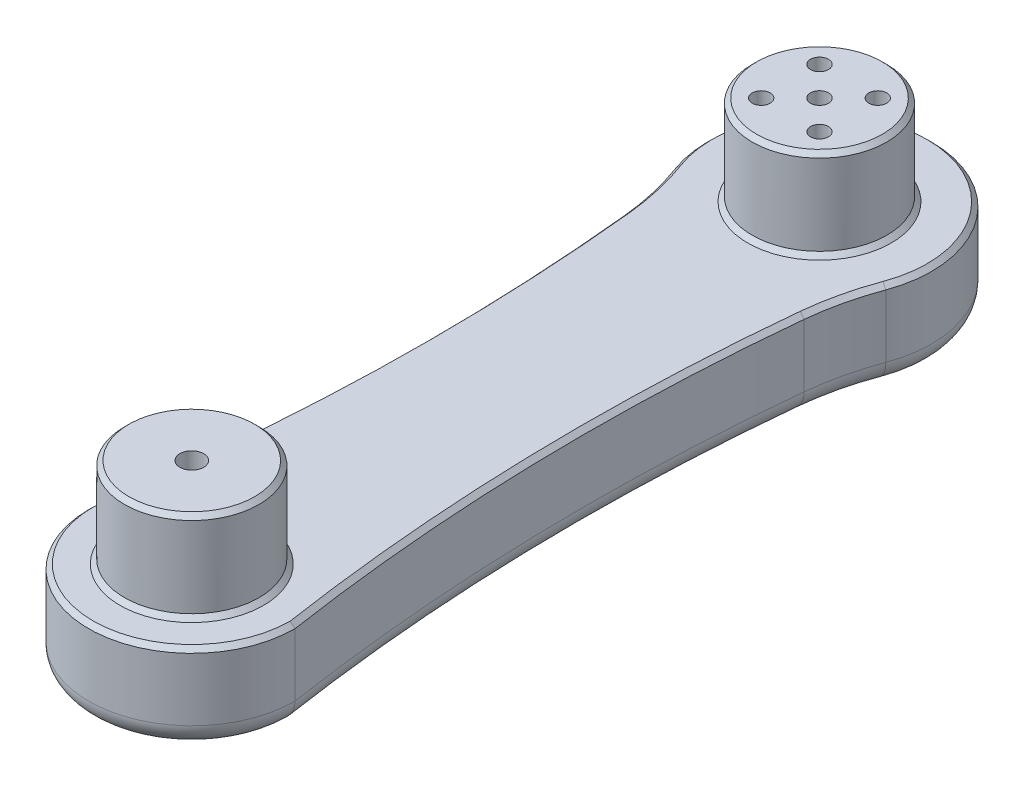
ISO-10303-21;
HEADER;
FILE_DESCRIPTION(('STEP AP214'),'2;1');
FILE_NAME('part.step','',(''),(''),'','','');
FILE_SCHEMA(('AUTOMOTIVE_DESIGN { 1 0 10303 214 1 1 1 1 }'));
ENDSEC;
DATA;
#1=APPLICATION_CONTEXT('core data for automotive mechanical design processes');
#2=APPLICATION_PROTOCOL_DEFINITION('international standard','automotive_design',2000,#1);
#3=PRODUCT_CONTEXT('',#1,'mechanical');
#4=PRODUCT('Part','Part','',(#3));
#5=PRODUCT_RELATED_PRODUCT_CATEGORY('part','',(#4));
#6=PRODUCT_DEFINITION_FORMATION('','',#4);
#7=PRODUCT_DEFINITION_CONTEXT('part definition',#1,'design');
#8=PRODUCT_DEFINITION('design','',#6,#7);
#9=PRODUCT_DEFINITION_SHAPE('','',#8);
#10=(LENGTH_UNIT() NAMED_UNIT(*) SI_UNIT(.MILLI.,.METRE.));
#11=(NAMED_UNIT(*) PLANE_ANGLE_UNIT() SI_UNIT($,.RADIAN.));
#12=(NAMED_UNIT(*) SI_UNIT($,.STERADIAN.) SOLID_ANGLE_UNIT());
#13=UNCERTAINTY_MEASURE_WITH_UNIT(LENGTH_MEASURE(1.E-05),#10,'distance_accuracy_value','');
#14=(GEOMETRIC_REPRESENTATION_CONTEXT(3) GLOBAL_UNCERTAINTY_ASSIGNED_CONTEXT((#13)) GLOBAL_UNIT_ASSIGNED_CONTEXT((#10,
#11,#12)) REPRESENTATION_CONTEXT('',''));
#15=CARTESIAN_POINT('',(0.,0.,0.));
#16=DIRECTION('',(0.,0.,1.));
#17=DIRECTION('',(1.,0.,0.));
#18=AXIS2_PLACEMENT_3D('',#15,#16,#17);
#19=CARTESIAN_POINT('',(0.,0.,0.));
#20=DIRECTION('',(0.,1.,0.));
#21=DIRECTION('',(0.,0.,1.));
#22=AXIS2_PLACEMENT_3D('',#19,#20,#21);
#23=CYLINDRICAL_SURFACE('',#22,2.65);
#24=CARTESIAN_POINT('',(0.,40.,0.));
#25=DIRECTION('',(0.,1.,0.));
#26=DIRECTION('',(0.,0.,1.));
#27=AXIS2_PLACEMENT_3D('',#24,#25,#26);
#28=CIRCLE('',#27,2.65);
#29=CARTESIAN_POINT('',(0.,40.,2.65));
#30=VERTEX_POINT('',#29);
#31=EDGE_CURVE('E145',#30,#30,#28,.T.);
#32=ORIENTED_EDGE('',*,*,#31,.T.);
#33=EDGE_LOOP('',(#32));
#34=FACE_BOUND('',#33,.T.);
#35=CARTESIAN_POINT('',(0.,8.,0.));
#36=DIRECTION('',(0.,-1.,0.));
#37=DIRECTION('',(0.,0.,-1.));
#38=AXIS2_PLACEMENT_3D('',#35,#36,#37);
#39=CIRCLE('',#38,2.65);
#40=CARTESIAN_POINT('',(0.,8.,-2.65));
#41=VERTEX_POINT('',#40);
#42=EDGE_CURVE('E265',#41,#41,#39,.F.);
#43=ORIENTED_EDGE('',*,*,#42,.F.);
#44=EDGE_LOOP('',(#43));
#45=FACE_BOUND('',#44,.T.);
#46=ADVANCED_FACE('F41',(#34,#45),#23,.F.);
#47=CARTESIAN_POINT('',(79.7317394305135,20.,-110.540710677535));
#48=DIRECTION('',(0.,-1.,0.));
#49=DIRECTION('',(0.,0.,-1.));
#50=AXIS2_PLACEMENT_3D('',#47,#48,#49);
#51=CYLINDRICAL_SURFACE('',#50,60.);
#52=DIRECTION('',(0.,-1.,0.));
#53=VECTOR('',#52,1.);
#54=CARTESIAN_POINT('',(20.0338907014118,20.,-116.554599362678));
#55=LINE('',#54,#53);
#56=CARTESIAN_POINT('',(20.0338907014118,19.,-116.554599362678));
#57=VERTEX_POINT('',#56);
#58=CARTESIAN_POINT('',(20.0338907014118,5.,-116.554599362678));
#59=VERTEX_POINT('',#58);
#60=EDGE_CURVE('E231',#57,#59,#55,.T.);
#61=ORIENTED_EDGE('',*,*,#60,.T.);
#62=CARTESIAN_POINT('',(79.7317394305135,5.,-110.540710677535));
#63=DIRECTION('',(0.,-1.,0.));
#64=DIRECTION('',(0.,0.,-1.));
#65=AXIS2_PLACEMENT_3D('',#62,#63,#64);
#66=CIRCLE('',#65,60.);
#67=CARTESIAN_POINT('',(23.4505115972098,5.,-131.335503140452));
#68=VERTEX_POINT('',#67);
#69=EDGE_CURVE('E251',#59,#68,#66,.T.);
#70=ORIENTED_EDGE('',*,*,#69,.T.);
#71=DIRECTION('',(0.,-1.,0.));
#72=VECTOR('',#71,1.);
#73=CARTESIAN_POINT('',(23.4505115972098,20.,-131.335503140452));
#74=LINE('',#73,#72);
#75=CARTESIAN_POINT('',(23.4505115972098,19.,-131.335503140452));
#76=VERTEX_POINT('',#75);
#77=EDGE_CURVE('E411',#76,#68,#74,.T.);
#78=ORIENTED_EDGE('',*,*,#77,.F.);
#79=CARTESIAN_POINT('',(79.7317394305135,19.,-110.540710677535));
#80=DIRECTION('',(0.,-1.,0.));
#81=DIRECTION('',(0.,0.,-1.));
#82=AXIS2_PLACEMENT_3D('',#79,#80,#81);
#83=CIRCLE('',#82,60.);
#84=EDGE_CURVE('E176',#76,#57,#83,.F.);
#85=ORIENTED_EDGE('',*,*,#84,.T.);
#86=EDGE_LOOP('',(#61,#70,#78,#85));
#87=FACE_BOUND('',#86,.T.);
#88=ADVANCED_FACE('F346',(#87),#51,.F.);
#89=CARTESIAN_POINT('',(0.,20.,-140.));
#90=DIRECTION('',(0.,-1.,0.));
#91=DIRECTION('',(0.,0.,-1.));
#92=AXIS2_PLACEMENT_3D('',#89,#90,#91);
#93=CYLINDRICAL_SURFACE('',#92,25.);
#94=ORIENTED_EDGE('',*,*,#77,.T.);
#95=CARTESIAN_POINT('',(0.,5.,-140.));
#96=DIRECTION('',(0.,-1.,0.));
#97=DIRECTION('',(0.,0.,-1.));
#98=AXIS2_PLACEMENT_3D('',#95,#96,#97);
#99=CIRCLE('',#98,25.);
#100=CARTESIAN_POINT('',(-23.4505115972098,5.,-131.335503140451));
#101=VERTEX_POINT('',#100);
#102=EDGE_CURVE('E249',#68,#101,#99,.F.);
#103=ORIENTED_EDGE('',*,*,#102,.T.);
#104=DIRECTION('',(0.,-1.,0.));
#105=VECTOR('',#104,1.);
#106=CARTESIAN_POINT('',(-23.4505115972098,20.,-131.335503140451));
#107=LINE('',#106,#105);
#108=CARTESIAN_POINT('',(-23.4505115972098,19.,-131.335503140451));
#109=VERTEX_POINT('',#108);
#110=EDGE_CURVE('E415',#109,#101,#107,.T.);
#111=ORIENTED_EDGE('',*,*,#110,.F.);
#112=CARTESIAN_POINT('',(0.,19.,-140.));
#113=DIRECTION('',(0.,-1.,0.));
#114=DIRECTION('',(0.,0.,-1.));
#115=AXIS2_PLACEMENT_3D('',#112,#113,#114);
#116=CIRCLE('',#115,25.);
#117=EDGE_CURVE('E174',#109,#76,#116,.T.);
#118=ORIENTED_EDGE('',*,*,#117,.T.);
#119=EDGE_LOOP('',(#94,#103,#111,#118));
#120=FACE_BOUND('',#119,.T.);
#121=ADVANCED_FACE('F353',(#120),#93,.T.);
#122=CARTESIAN_POINT('',(-79.7317394305134,20.,-110.540710677535));
#123=DIRECTION('',(0.,-1.,0.));
#124=DIRECTION('',(0.,0.,-1.));
#125=AXIS2_PLACEMENT_3D('',#122,#123,#124);
#126=CYLINDRICAL_SURFACE('',#125,60.);
#127=ORIENTED_EDGE('',*,*,#110,.T.);
#128=CARTESIAN_POINT('',(-79.7317394305134,5.,-110.540710677535));
#129=DIRECTION('',(0.,-1.,0.));
#130=DIRECTION('',(0.,0.,-1.));
#131=AXIS2_PLACEMENT_3D('',#128,#129,#130);
#132=CIRCLE('',#131,60.);
#133=CARTESIAN_POINT('',(-20.0338907014117,5.,-116.554599362678));
#134=VERTEX_POINT('',#133);
#135=EDGE_CURVE('E247',#101,#134,#132,.T.);
#136=ORIENTED_EDGE('',*,*,#135,.T.);
#137=DIRECTION('',(0.,-1.,0.));
#138=VECTOR('',#137,1.);
#139=CARTESIAN_POINT('',(-20.0338907014117,20.,-116.554599362678));
#140=LINE('',#139,#138);
#141=CARTESIAN_POINT('',(-20.0338907014117,19.,-116.554599362678));
#142=VERTEX_POINT('',#141);
#143=EDGE_CURVE('E434',#142,#134,#140,.T.);
#144=ORIENTED_EDGE('',*,*,#143,.F.);
#145=CARTESIAN_POINT('',(-79.7317394305134,19.,-110.540710677535));
#146=DIRECTION('',(0.,-1.,0.));
#147=DIRECTION('',(0.,0.,-1.));
#148=AXIS2_PLACEMENT_3D('',#145,#146,#147);
#149=CIRCLE('',#148,60.);
#150=EDGE_CURVE('E172',#142,#109,#149,.F.);
#151=ORIENTED_EDGE('',*,*,#150,.T.);
#152=EDGE_LOOP('',(#127,#136,#144,#151));
#153=FACE_BOUND('',#152,.T.);
#154=ADVANCED_FACE('F386',(#153),#126,.F.);
#155=CARTESIAN_POINT('',(-482.165728502631,20.,-70.));
#156=DIRECTION('',(0.,-1.,0.));
#157=DIRECTION('',(0.,0.,-1.));
#158=AXIS2_PLACEMENT_3D('',#155,#156,#157);
#159=CYLINDRICAL_SURFACE('',#158,464.470845405125);
#160=ORIENTED_EDGE('',*,*,#143,.T.);
#161=CARTESIAN_POINT('',(-482.165728502631,5.,-70.));
#162=DIRECTION('',(0.,-1.,0.));
#163=DIRECTION('',(0.,0.,-1.));
#164=AXIS2_PLACEMENT_3D('',#161,#162,#163);
#165=CIRCLE('',#164,464.470845405125);
#166=CARTESIAN_POINT('',(-23.,5.,0.));
#167=VERTEX_POINT('',#166);
#168=EDGE_CURVE('E180',#134,#167,#165,.T.);
#169=ORIENTED_EDGE('',*,*,#168,.T.);
#170=DIRECTION('',(0.,-1.,0.));
#171=VECTOR('',#170,1.);
#172=CARTESIAN_POINT('',(-23.,20.,0.));
#173=LINE('',#172,#171);
#174=CARTESIAN_POINT('',(-23.,19.,0.));
#175=VERTEX_POINT('',#174);
#176=EDGE_CURVE('E432',#175,#167,#173,.T.);
#177=ORIENTED_EDGE('',*,*,#176,.F.);
#178=CARTESIAN_POINT('',(-482.165728502631,19.,-70.));
#179=DIRECTION('',(0.,-1.,0.));
#180=DIRECTION('',(0.,0.,-1.));
#181=AXIS2_PLACEMENT_3D('',#178,#179,#180);
#182=CIRCLE('',#181,464.470845405125);
#183=EDGE_CURVE('E170',#175,#142,#182,.F.);
#184=ORIENTED_EDGE('',*,*,#183,.T.);
#185=EDGE_LOOP('',(#160,#169,#177,#184));
#186=FACE_BOUND('',#185,.T.);
#187=ADVANCED_FACE('F383',(#186),#159,.F.);
#188=CARTESIAN_POINT('',(0.,20.,0.));
#189=DIRECTION('',(0.,-1.,0.));
#190=DIRECTION('',(0.,0.,-1.));
#191=AXIS2_PLACEMENT_3D('',#188,#189,#190);
#192=CYLINDRICAL_SURFACE('',#191,23.);
#193=ORIENTED_EDGE('',*,*,#176,.T.);
#194=CARTESIAN_POINT('',(0.,5.,0.));
#195=DIRECTION('',(0.,-1.,0.));
#196=DIRECTION('',(0.,0.,-1.));
#197=AXIS2_PLACEMENT_3D('',#194,#195,#196);
#198=CIRCLE('',#197,23.);
#199=CARTESIAN_POINT('',(22.9999999999999,5.,-1.2490009027033E-13));
#200=VERTEX_POINT('',#199);
#201=EDGE_CURVE('E57',#167,#200,#198,.F.);
#202=ORIENTED_EDGE('',*,*,#201,.T.);
#203=DIRECTION('',(0.,-1.,0.));
#204=VECTOR('',#203,1.);
#205=CARTESIAN_POINT('',(22.9999999999999,20.,-1.2490009027033E-13));
#206=LINE('',#205,#204);
#207=CARTESIAN_POINT('',(22.9999999999999,19.,-1.2490009027033E-13));
#208=VERTEX_POINT('',#207);
#209=EDGE_CURVE('E431',#208,#200,#206,.T.);
#210=ORIENTED_EDGE('',*,*,#209,.F.);
#211=CARTESIAN_POINT('',(0.,19.,0.));
#212=DIRECTION('',(0.,-1.,0.));
#213=DIRECTION('',(0.,0.,-1.));
#214=AXIS2_PLACEMENT_3D('',#211,#212,#213);
#215=CIRCLE('',#214,23.);
#216=EDGE_CURVE('E163',#208,#175,#215,.T.);
#217=ORIENTED_EDGE('',*,*,#216,.T.);
#218=EDGE_LOOP('',(#193,#202,#210,#217));
#219=FACE_BOUND('',#218,.T.);
#220=ADVANCED_FACE('F380',(#219),#192,.T.);
#221=CARTESIAN_POINT('',(482.165728502631,20.,-70.));
#222=DIRECTION('',(0.,-1.,0.));
#223=DIRECTION('',(0.,0.,-1.));
#224=AXIS2_PLACEMENT_3D('',#221,#222,#223);
#225=CYLINDRICAL_SURFACE('',#224,464.470845405125);
#226=ORIENTED_EDGE('',*,*,#209,.T.);
#227=CARTESIAN_POINT('',(482.165728502631,5.,-70.));
#228=DIRECTION('',(0.,-1.,0.));
#229=DIRECTION('',(0.,0.,-1.));
#230=AXIS2_PLACEMENT_3D('',#227,#228,#229);
#231=CIRCLE('',#230,464.470845405125);
#232=EDGE_CURVE('E64',#200,#59,#231,.T.);
#233=ORIENTED_EDGE('',*,*,#232,.T.);
#234=ORIENTED_EDGE('',*,*,#60,.F.);
#235=CARTESIAN_POINT('',(482.165728502631,19.,-70.));
#236=DIRECTION('',(0.,-1.,0.));
#237=DIRECTION('',(0.,0.,-1.));
#238=AXIS2_PLACEMENT_3D('',#235,#236,#237);
#239=CIRCLE('',#238,464.470845405125);
#240=EDGE_CURVE('E141',#57,#208,#239,.F.);
#241=ORIENTED_EDGE('',*,*,#240,.T.);
#242=EDGE_LOOP('',(#226,#233,#234,#241));
#243=FACE_BOUND('',#242,.T.);
#244=ADVANCED_FACE('F374',(#243),#225,.F.);
#245=CARTESIAN_POINT('',(39.8658697152567,20.,-125.270355338768));
#246=DIRECTION('',(0.,-1.,0.));
#247=DIRECTION('',(0.,0.,-1.));
#248=AXIS2_PLACEMENT_3D('',#245,#246,#247);
#249=PLANE('',#248);
#250=CARTESIAN_POINT('',(0.,20.,-140.));
#251=DIRECTION('',(0.,-1.,0.));
#252=DIRECTION('',(0.,0.,-1.));
#253=AXIS2_PLACEMENT_3D('',#250,#251,#252);
#254=CIRCLE('',#253,16.01);
#255=CARTESIAN_POINT('',(0.,20.,-156.01));
#256=VERTEX_POINT('',#255);
#257=EDGE_CURVE('E50',#256,#256,#254,.T.);
#258=ORIENTED_EDGE('',*,*,#257,.T.);
#259=EDGE_LOOP('',(#258));
#260=FACE_BOUND('',#259,.T.);
#261=CARTESIAN_POINT('',(0.,20.,0.));
#262=DIRECTION('',(0.,-1.,0.));
#263=DIRECTION('',(0.,0.,-1.));
#264=AXIS2_PLACEMENT_3D('',#261,#262,#263);
#265=CIRCLE('',#264,22.);
#266=CARTESIAN_POINT('',(-21.9998724689642,20.,0.0749089401107759));
#267=VERTEX_POINT('',#266);
#268=CARTESIAN_POINT('',(21.9998724689643,20.,0.0749089401108745));
#269=VERTEX_POINT('',#268);
#270=EDGE_CURVE('E160',#267,#269,#265,.F.);
#271=ORIENTED_EDGE('',*,*,#270,.T.);
#272=CARTESIAN_POINT('',(482.165728502631,20.,-70.));
#273=DIRECTION('',(0.,-1.,0.));
#274=DIRECTION('',(0.,0.,-1.));
#275=AXIS2_PLACEMENT_3D('',#272,#273,#274);
#276=CIRCLE('',#275,465.470845405125);
#277=CARTESIAN_POINT('',(19.0389265559268,20.,-116.654830840764));
#278=VERTEX_POINT('',#277);
#279=EDGE_CURVE('E139',#269,#278,#276,.T.);
#280=ORIENTED_EDGE('',*,*,#279,.T.);
#281=CARTESIAN_POINT('',(79.7317394305135,20.,-110.540710677535));
#282=DIRECTION('',(0.,-1.,0.));
#283=DIRECTION('',(0.,0.,-1.));
#284=AXIS2_PLACEMENT_3D('',#281,#282,#283);
#285=CIRCLE('',#284,61.);
#286=CARTESIAN_POINT('',(22.5124911333215,20.,-131.682083014833));
#287=VERTEX_POINT('',#286);
#288=EDGE_CURVE('E148',#278,#287,#285,.T.);
#289=ORIENTED_EDGE('',*,*,#288,.T.);
#290=CARTESIAN_POINT('',(0.,20.,-140.));
#291=DIRECTION('',(0.,-1.,0.));
#292=DIRECTION('',(0.,0.,-1.));
#293=AXIS2_PLACEMENT_3D('',#290,#291,#292);
#294=CIRCLE('',#293,24.);
#295=CARTESIAN_POINT('',(-22.5124911333214,20.,-131.682083014833));
#296=VERTEX_POINT('',#295);
#297=EDGE_CURVE('E154',#287,#296,#294,.F.);
#298=ORIENTED_EDGE('',*,*,#297,.T.);
#299=CARTESIAN_POINT('',(-79.7317394305134,20.,-110.540710677535));
#300=DIRECTION('',(0.,-1.,0.));
#301=DIRECTION('',(0.,0.,-1.));
#302=AXIS2_PLACEMENT_3D('',#299,#300,#301);
#303=CIRCLE('',#302,61.);
#304=CARTESIAN_POINT('',(-19.0389265559267,20.,-116.654830840764));
#305=VERTEX_POINT('',#304);
#306=EDGE_CURVE('E422',#296,#305,#303,.T.);
#307=ORIENTED_EDGE('',*,*,#306,.T.);
#308=CARTESIAN_POINT('',(-482.165728502631,20.,-70.));
#309=DIRECTION('',(0.,-1.,0.));
#310=DIRECTION('',(0.,0.,-1.));
#311=AXIS2_PLACEMENT_3D('',#308,#309,#310);
#312=CIRCLE('',#311,465.470845405125);
#313=EDGE_CURVE('E165',#305,#267,#312,.T.);
#314=ORIENTED_EDGE('',*,*,#313,.T.);
#315=EDGE_LOOP('',(#271,#280,#289,#298,#307,#314));
#316=FACE_BOUND('',#315,.T.);
#317=CARTESIAN_POINT('',(0.,20.,0.));
#318=DIRECTION('',(0.,-1.,0.));
#319=DIRECTION('',(0.,0.,-1.));
#320=AXIS2_PLACEMENT_3D('',#317,#318,#319);
#321=CIRCLE('',#320,16.01);
#322=CARTESIAN_POINT('',(0.,20.,-16.01));
#323=VERTEX_POINT('',#322);
#324=EDGE_CURVE('E155',#323,#323,#321,.T.);
#325=ORIENTED_EDGE('',*,*,#324,.T.);
#326=EDGE_LOOP('',(#325));
#327=FACE_BOUND('',#326,.T.);
#328=ADVANCED_FACE('F157',(#260,#316,#327),#249,.F.);
#329=CARTESIAN_POINT('',(39.8658697152567,0.,-125.270355338768));
#330=DIRECTION('',(0.,-1.,0.));
#331=DIRECTION('',(0.,0.,-1.));
#332=AXIS2_PLACEMENT_3D('',#329,#330,#331);
#333=PLANE('',#332);
#334=CARTESIAN_POINT('',(0.,0.,-140.));
#335=DIRECTION('',(0.,1.,0.));
#336=DIRECTION('',(0.,0.,1.));
#337=AXIS2_PLACEMENT_3D('',#334,#335,#336);
#338=CIRCLE('',#337,2.01);
#339=CARTESIAN_POINT('',(0.,0.,-137.99));
#340=VERTEX_POINT('',#339);
#341=EDGE_CURVE('E713',#340,#340,#338,.T.);
#342=ORIENTED_EDGE('',*,*,#341,.T.);
#343=EDGE_LOOP('',(#342));
#344=FACE_BOUND('',#343,.T.);
#345=CARTESIAN_POINT('',(0.,0.,0.));
#346=DIRECTION('',(0.,-1.,0.));
#347=DIRECTION('',(0.,0.,-1.));
#348=AXIS2_PLACEMENT_3D('',#345,#346,#347);
#349=CIRCLE('',#348,4.15000000000001);
#350=CARTESIAN_POINT('',(0.,0.,-4.15000000000001));
#351=VERTEX_POINT('',#350);
#352=EDGE_CURVE('E305',#351,#351,#349,.F.);
#353=ORIENTED_EDGE('',*,*,#352,.T.);
#354=EDGE_LOOP('',(#353));
#355=FACE_BOUND('',#354,.T.);
#356=CARTESIAN_POINT('',(0.,0.,0.));
#357=DIRECTION('',(0.,-1.,0.));
#358=DIRECTION('',(0.,0.,-1.));
#359=AXIS2_PLACEMENT_3D('',#356,#357,#358);
#360=CIRCLE('',#359,18.);
#361=CARTESIAN_POINT('',(17.9965020642617,0.,0.354842853985803));
#362=VERTEX_POINT('',#361);
#363=CARTESIAN_POINT('',(-17.9965020642617,0.,0.354842853985715));
#364=VERTEX_POINT('',#363);
#365=EDGE_CURVE('E236',#362,#364,#360,.T.);
#366=ORIENTED_EDGE('',*,*,#365,.T.);
#367=CARTESIAN_POINT('',(-482.165728502631,0.,-70.));
#368=DIRECTION('',(0.,-1.,0.));
#369=DIRECTION('',(0.,0.,-1.));
#370=AXIS2_PLACEMENT_3D('',#367,#368,#369);
#371=CIRCLE('',#370,469.470845405125);
#372=CARTESIAN_POINT('',(-15.0590699739866,0.,-117.055756753106));
#373=VERTEX_POINT('',#372);
#374=EDGE_CURVE('E244',#364,#373,#371,.F.);
#375=ORIENTED_EDGE('',*,*,#374,.T.);
#376=CARTESIAN_POINT('',(-79.7317394305134,0.,-110.540710677535));
#377=DIRECTION('',(0.,-1.,0.));
#378=DIRECTION('',(0.,0.,-1.));
#379=AXIS2_PLACEMENT_3D('',#376,#377,#378);
#380=CIRCLE('',#379,65.);
#381=CARTESIAN_POINT('',(-18.7604092777678,0.,-133.068402512361));
#382=VERTEX_POINT('',#381);
#383=EDGE_CURVE('E242',#373,#382,#380,.F.);
#384=ORIENTED_EDGE('',*,*,#383,.T.);
#385=CARTESIAN_POINT('',(0.,0.,-140.));
#386=DIRECTION('',(0.,-1.,0.));
#387=DIRECTION('',(0.,0.,-1.));
#388=AXIS2_PLACEMENT_3D('',#385,#386,#387);
#389=CIRCLE('',#388,20.);
#390=CARTESIAN_POINT('',(18.7604092777679,0.,-133.068402512361));
#391=VERTEX_POINT('',#390);
#392=EDGE_CURVE('E240',#382,#391,#389,.T.);
#393=ORIENTED_EDGE('',*,*,#392,.T.);
#394=CARTESIAN_POINT('',(79.7317394305135,0.,-110.540710677535));
#395=DIRECTION('',(0.,-1.,0.));
#396=DIRECTION('',(0.,0.,-1.));
#397=AXIS2_PLACEMENT_3D('',#394,#395,#396);
#398=CIRCLE('',#397,65.);
#399=CARTESIAN_POINT('',(15.0590699739866,0.,-117.055756753107));
#400=VERTEX_POINT('',#399);
#401=EDGE_CURVE('E238',#391,#400,#398,.F.);
#402=ORIENTED_EDGE('',*,*,#401,.T.);
#403=CARTESIAN_POINT('',(482.165728502631,0.,-70.));
#404=DIRECTION('',(0.,-1.,0.));
#405=DIRECTION('',(0.,0.,-1.));
#406=AXIS2_PLACEMENT_3D('',#403,#404,#405);
#407=CIRCLE('',#406,469.470845405125);
#408=EDGE_CURVE('E234',#400,#362,#407,.F.);
#409=ORIENTED_EDGE('',*,*,#408,.T.);
#410=EDGE_LOOP('',(#366,#375,#384,#393,#402,#409));
#411=FACE_BOUND('',#410,.T.);
#412=ADVANCED_FACE('F370',(#344,#355,#411),#333,.T.);
#413=CARTESIAN_POINT('',(0.,40.,0.));
#414=DIRECTION('',(0.,-1.,0.));
#415=DIRECTION('',(0.,0.,-1.));
#416=AXIS2_PLACEMENT_3D('',#413,#414,#415);
#417=CYLINDRICAL_SURFACE('',#416,15.01);
#418=CARTESIAN_POINT('',(0.,21.,0.));
#419=DIRECTION('',(0.,-1.,0.));
#420=DIRECTION('',(0.,0.,-1.));
#421=AXIS2_PLACEMENT_3D('',#418,#419,#420);
#422=CIRCLE('',#421,15.01);
#423=CARTESIAN_POINT('',(0.,21.,-15.01));
#424=VERTEX_POINT('',#423);
#425=EDGE_CURVE('E178',#424,#424,#422,.F.);
#426=ORIENTED_EDGE('',*,*,#425,.T.);
#427=EDGE_LOOP('',(#426));
#428=FACE_BOUND('',#427,.T.);
#429=CARTESIAN_POINT('',(0.,39.,0.));
#430=DIRECTION('',(0.,1.,0.));
#431=DIRECTION('',(0.,0.,1.));
#432=AXIS2_PLACEMENT_3D('',#429,#430,#431);
#433=CIRCLE('',#432,15.01);
#434=CARTESIAN_POINT('',(0.,39.,15.01));
#435=VERTEX_POINT('',#434);
#436=EDGE_CURVE('E406',#435,#435,#433,.F.);
#437=ORIENTED_EDGE('',*,*,#436,.T.);
#438=EDGE_LOOP('',(#437));
#439=FACE_BOUND('',#438,.T.);
#440=ADVANCED_FACE('F366',(#428,#439),#417,.T.);
#441=CARTESIAN_POINT('',(0.,40.,0.));
#442=DIRECTION('',(0.,1.,0.));
#443=DIRECTION('',(0.,0.,1.));
#444=AXIS2_PLACEMENT_3D('',#441,#442,#443);
#445=PLANE('',#444);
#446=ORIENTED_EDGE('',*,*,#31,.F.);
#447=EDGE_LOOP('',(#446));
#448=FACE_BOUND('',#447,.T.);
#449=CARTESIAN_POINT('',(0.,40.,0.));
#450=DIRECTION('',(0.,1.,0.));
#451=DIRECTION('',(0.,0.,1.));
#452=AXIS2_PLACEMENT_3D('',#449,#450,#451);
#453=CIRCLE('',#452,14.01);
#454=CARTESIAN_POINT('',(0.,40.,14.01));
#455=VERTEX_POINT('',#454);
#456=EDGE_CURVE('E409',#455,#455,#453,.T.);
#457=ORIENTED_EDGE('',*,*,#456,.T.);
#458=EDGE_LOOP('',(#457));
#459=FACE_BOUND('',#458,.T.);
#460=ADVANCED_FACE('F362',(#448,#459),#445,.T.);
#461=CARTESIAN_POINT('',(0.,40.,0.));
#462=DIRECTION('',(0.,-1.,0.));
#463=DIRECTION('',(0.,0.,-1.));
#464=AXIS2_PLACEMENT_3D('',#461,#462,#463);
#465=CONICAL_SURFACE('',#464,14.01,0.785398163397436);
#466=ORIENTED_EDGE('',*,*,#436,.F.);
#467=EDGE_LOOP('',(#466));
#468=FACE_BOUND('',#467,.T.);
#469=ORIENTED_EDGE('',*,*,#456,.F.);
#470=EDGE_LOOP('',(#469));
#471=FACE_BOUND('',#470,.T.);
#472=ADVANCED_FACE('F365',(#468,#471),#465,.T.);
#473=CARTESIAN_POINT('',(-79.7317394305134,20.,-110.540710677535));
#474=DIRECTION('',(0.,1.,0.));
#475=DIRECTION('',(0.,0.,1.));
#476=AXIS2_PLACEMENT_3D('',#473,#474,#475);
#477=CONICAL_SURFACE('',#476,61.,0.785398163397438);
#478=DIRECTION('',(0.663280630907225,0.707106781186556,-0.245068979398254));
#479=VECTOR('',#478,1.);
#480=CARTESIAN_POINT('',(-23.4505115972098,19.,-131.335503140451));
#481=LINE('',#480,#479);
#482=EDGE_CURVE('E225',#109,#296,#481,.T.);
#483=ORIENTED_EDGE('',*,*,#482,.F.);
#484=ORIENTED_EDGE('',*,*,#150,.F.);
#485=DIRECTION('',(-0.703545894309934,-0.707106781186555,0.0708743578427609));
#486=VECTOR('',#485,1.);
#487=CARTESIAN_POINT('',(-19.0389265559267,20.,-116.654830840764));
#488=LINE('',#487,#486);
#489=EDGE_CURVE('E228',#305,#142,#488,.T.);
#490=ORIENTED_EDGE('',*,*,#489,.F.);
#491=ORIENTED_EDGE('',*,*,#306,.F.);
#492=EDGE_LOOP('',(#483,#484,#490,#491));
#493=FACE_BOUND('',#492,.T.);
#494=ADVANCED_FACE('F215',(#493),#477,.F.);
#495=CARTESIAN_POINT('',(-482.165728502631,20.,-70.));
#496=DIRECTION('',(0.,1.,0.));
#497=DIRECTION('',(0.,0.,1.));
#498=AXIS2_PLACEMENT_3D('',#495,#496,#497);
#499=CONICAL_SURFACE('',#498,465.470845405125,0.785398163397445);
#500=ORIENTED_EDGE('',*,*,#489,.T.);
#501=ORIENTED_EDGE('',*,*,#183,.F.);
#502=CARTESIAN_POINT('',(-23.,19.,0.));
#503=CARTESIAN_POINT('',(-22.833328374255,19.1666718511653,0.0126331763559206));
#504=CARTESIAN_POINT('',(-22.6666486006392,19.3333411099049,0.0251921761967329));
#505=CARTESIAN_POINT('',(-22.3332727569607,19.6666744432383,0.0501618229009855));
#506=CARTESIAN_POINT('',(-22.1665766868979,19.833338517832,0.0625724697637979));
#507=CARTESIAN_POINT('',(-21.9998724689643,20.,0.0749089401108717));
#508=B_SPLINE_CURVE_WITH_KNOTS('',3,(#502,#503,#504,#505,#506,#507),.UNSPECIFIED.,.F.,.F.,(4,2,
4),(0.,0.708143103451322,1.41628620990026),.UNSPECIFIED.);
#509=EDGE_CURVE('E218',#267,#175,#508,.F.);
#510=ORIENTED_EDGE('',*,*,#509,.F.);
#511=ORIENTED_EDGE('',*,*,#313,.F.);
#512=EDGE_LOOP('',(#500,#501,#510,#511));
#513=FACE_BOUND('',#512,.T.);
#514=ADVANCED_FACE('F207',(#513),#499,.F.);
#515=CARTESIAN_POINT('',(0.,20.,-140.));
#516=DIRECTION('',(0.,-1.,0.));
#517=DIRECTION('',(0.,0.,-1.));
#518=AXIS2_PLACEMENT_3D('',#515,#516,#517);
#519=CONICAL_SURFACE('',#518,24.,0.785398163397436);
#520=ORIENTED_EDGE('',*,*,#482,.T.);
#521=ORIENTED_EDGE('',*,*,#297,.F.);
#522=DIRECTION('',(-0.663280630907225,0.707106781186556,-0.245068979398254));
#523=VECTOR('',#522,1.);
#524=CARTESIAN_POINT('',(23.4505115972098,19.,-131.335503140452));
#525=LINE('',#524,#523);
#526=EDGE_CURVE('E151',#76,#287,#525,.T.);
#527=ORIENTED_EDGE('',*,*,#526,.F.);
#528=ORIENTED_EDGE('',*,*,#117,.F.);
#529=EDGE_LOOP('',(#520,#521,#527,#528));
#530=FACE_BOUND('',#529,.T.);
#531=ADVANCED_FACE('F214',(#530),#519,.T.);
#532=CARTESIAN_POINT('',(0.,20.,0.));
#533=DIRECTION('',(0.,-1.,0.));
#534=DIRECTION('',(0.,0.,-1.));
#535=AXIS2_PLACEMENT_3D('',#532,#533,#534);
#536=CONICAL_SURFACE('',#535,22.,0.785398163397436);
#537=ORIENTED_EDGE('',*,*,#509,.T.);
#538=ORIENTED_EDGE('',*,*,#216,.F.);
#539=CARTESIAN_POINT('',(22.9999999999999,19.,-1.2490009027033E-13));
#540=CARTESIAN_POINT('',(22.8333283742549,19.1666718511653,0.01263317635586));
#541=CARTESIAN_POINT('',(22.6666486006392,19.3333411099049,0.0251921761967274));
#542=CARTESIAN_POINT('',(22.3332727569607,19.6666744432383,0.0501618229010765));
#543=CARTESIAN_POINT('',(22.1665766868979,19.833338517832,0.0625724697639301));
#544=CARTESIAN_POINT('',(21.9998724689643,20.,0.0749089401110383));
#545=B_SPLINE_CURVE_WITH_KNOTS('',3,(#539,#540,#541,#542,#543,#544),.UNSPECIFIED.,.F.,.F.,(4,2,
4),(0.,0.708143103451318,1.41628620990025),.UNSPECIFIED.);
#546=EDGE_CURVE('E144',#269,#208,#545,.F.);
#547=ORIENTED_EDGE('',*,*,#546,.F.);
#548=ORIENTED_EDGE('',*,*,#270,.F.);
#549=EDGE_LOOP('',(#537,#538,#547,#548));
#550=FACE_BOUND('',#549,.T.);
#551=ADVANCED_FACE('F191',(#550),#536,.T.);
#552=CARTESIAN_POINT('',(79.7317394305135,20.,-110.540710677535));
#553=DIRECTION('',(0.,1.,0.));
#554=DIRECTION('',(0.,0.,1.));
#555=AXIS2_PLACEMENT_3D('',#552,#553,#554);
#556=CONICAL_SURFACE('',#555,61.,0.785398163397438);
#557=ORIENTED_EDGE('',*,*,#526,.T.);
#558=ORIENTED_EDGE('',*,*,#288,.F.);
#559=DIRECTION('',(-0.703545894309937,0.707106781186553,-0.0708743578427607));
#560=VECTOR('',#559,1.);
#561=CARTESIAN_POINT('',(20.0338907014118,19.,-116.554599362678));
#562=LINE('',#561,#560);
#563=EDGE_CURVE('E135',#57,#278,#562,.T.);
#564=ORIENTED_EDGE('',*,*,#563,.F.);
#565=ORIENTED_EDGE('',*,*,#84,.F.);
#566=EDGE_LOOP('',(#557,#558,#564,#565));
#567=FACE_BOUND('',#566,.T.);
#568=ADVANCED_FACE('F149',(#567),#556,.F.);
#569=CARTESIAN_POINT('',(482.165728502631,20.,-70.));
#570=DIRECTION('',(0.,1.,0.));
#571=DIRECTION('',(0.,0.,1.));
#572=AXIS2_PLACEMENT_3D('',#569,#570,#571);
#573=CONICAL_SURFACE('',#572,465.470845405125,0.785398163397445);
#574=ORIENTED_EDGE('',*,*,#546,.T.);
#575=ORIENTED_EDGE('',*,*,#240,.F.);
#576=ORIENTED_EDGE('',*,*,#563,.T.);
#577=ORIENTED_EDGE('',*,*,#279,.F.);
#578=EDGE_LOOP('',(#574,#575,#576,#577));
#579=FACE_BOUND('',#578,.T.);
#580=ADVANCED_FACE('F137',(#579),#573,.F.);
#581=CARTESIAN_POINT('',(0.,21.,0.));
#582=DIRECTION('',(0.,-1.,0.));
#583=DIRECTION('',(0.,0.,-1.));
#584=AXIS2_PLACEMENT_3D('',#581,#582,#583);
#585=CONICAL_SURFACE('',#584,15.01,0.785398163397457);
#586=ORIENTED_EDGE('',*,*,#324,.F.);
#587=EDGE_LOOP('',(#586));
#588=FACE_BOUND('',#587,.T.);
#589=ORIENTED_EDGE('',*,*,#425,.F.);
#590=EDGE_LOOP('',(#589));
#591=FACE_BOUND('',#590,.T.);
#592=ADVANCED_FACE('F201',(#588,#591),#585,.T.);
#593=CARTESIAN_POINT('',(79.7317394305135,5.,-110.540710677535));
#594=DIRECTION('',(0.,-1.,0.));
#595=DIRECTION('',(0.,0.,-1.));
#596=AXIS2_PLACEMENT_3D('',#593,#594,#595);
#597=TOROIDAL_SURFACE('',#596,65.,5.);
#598=CARTESIAN_POINT('',(15.0590699739866,5.,-117.055756753107));
#599=DIRECTION('',(-0.100231478085719,0.,0.994964145485028));
#600=DIRECTION('',(0.994964145485028,0.,0.100231478085719));
#601=AXIS2_PLACEMENT_3D('',#598,#599,#600);
#602=CIRCLE('',#601,5.);
#603=EDGE_CURVE('E294',#400,#59,#602,.T.);
#604=ORIENTED_EDGE('',*,*,#603,.F.);
#605=ORIENTED_EDGE('',*,*,#401,.F.);
#606=CARTESIAN_POINT('',(18.7604092777679,5.,-133.068402512361));
#607=DIRECTION('',(0.346579874381942,0.,-0.938020463888394));
#608=DIRECTION('',(-0.938020463888394,0.,-0.346579874381942));
#609=AXIS2_PLACEMENT_3D('',#606,#607,#608);
#610=CIRCLE('',#609,5.);
#611=EDGE_CURVE('E297',#68,#391,#610,.T.);
#612=ORIENTED_EDGE('',*,*,#611,.F.);
#613=ORIENTED_EDGE('',*,*,#69,.F.);
#614=EDGE_LOOP('',(#604,#605,#612,#613));
#615=FACE_BOUND('',#614,.T.);
#616=ADVANCED_FACE('F463',(#615),#597,.T.);
#617=CARTESIAN_POINT('',(0.,5.,-140.));
#618=DIRECTION('',(0.,-1.,0.));
#619=DIRECTION('',(0.,0.,-1.));
#620=AXIS2_PLACEMENT_3D('',#617,#618,#619);
#621=TOROIDAL_SURFACE('',#620,20.,5.);
#622=ORIENTED_EDGE('',*,*,#611,.T.);
#623=ORIENTED_EDGE('',*,*,#392,.F.);
#624=CARTESIAN_POINT('',(-18.7604092777679,5.,-133.068402512361));
#625=DIRECTION('',(0.346579874381942,0.,0.938020463888394));
#626=DIRECTION('',(0.938020463888394,0.,-0.346579874381942));
#627=AXIS2_PLACEMENT_3D('',#624,#625,#626);
#628=CIRCLE('',#627,5.);
#629=EDGE_CURVE('E291',#101,#382,#628,.T.);
#630=ORIENTED_EDGE('',*,*,#629,.F.);
#631=ORIENTED_EDGE('',*,*,#102,.F.);
#632=EDGE_LOOP('',(#622,#623,#630,#631));
#633=FACE_BOUND('',#632,.T.);
#634=ADVANCED_FACE('F281',(#633),#621,.T.);
#635=CARTESIAN_POINT('',(482.165728502631,5.,-70.));
#636=DIRECTION('',(0.,-1.,0.));
#637=DIRECTION('',(0.,0.,-1.));
#638=AXIS2_PLACEMENT_3D('',#635,#636,#637);
#639=TOROIDAL_SURFACE('',#638,469.470845405125,5.);
#640=ORIENTED_EDGE('',*,*,#603,.T.);
#641=ORIENTED_EDGE('',*,*,#232,.F.);
#642=CARTESIAN_POINT('',(22.9999999999999,5.,-1.2490009027033E-13));
#643=CARTESIAN_POINT('',(23.0000152701209,4.85967578545601,-1.54724037407213E-06));
#644=CARTESIAN_POINT('',(22.9940933780411,4.7193538774575,0.00044763313441504));
#645=CARTESIAN_POINT('',(22.9704856383898,4.4397160016679,0.00223628491039502));
#646=CARTESIAN_POINT('',(22.952800414511,4.30039998094044,0.00357570911079555));
#647=CARTESIAN_POINT('',(22.9057943755299,4.02386611048724,0.00713232330796196));
#648=CARTESIAN_POINT('',(22.8764824870557,3.88664673475948,0.00934883989461075));
#649=CARTESIAN_POINT('',(22.8064392200786,3.61517287534606,0.0146378407741504));
#650=CARTESIAN_POINT('',(22.7657079695631,3.48091835844868,0.0177103154735279));
#651=CARTESIAN_POINT('',(22.6731049978302,3.21628942175729,0.0246828654782253));
#652=CARTESIAN_POINT('',(22.6212302640643,3.08591606207524,0.0285831645756131));
#653=CARTESIAN_POINT('',(22.5066988628813,2.82996405526028,0.0371751670402592));
#654=CARTESIAN_POINT('',(22.4440382321304,2.70438719142423,0.041867161307467));
#655=CARTESIAN_POINT('',(22.308436714146,2.45903764502551,0.0519940510785394));
#656=CARTESIAN_POINT('',(22.2355017069557,2.33926169491307,0.0574285216087164));
#657=CARTESIAN_POINT('',(22.0798194116823,2.10624141260337,0.0689931183884544));
#658=CARTESIAN_POINT('',(21.9970687154554,1.9929993694751,0.075123486231296));
#659=CARTESIAN_POINT('',(21.8222824227574,1.77378333551741,0.0880270896596019));
#660=CARTESIAN_POINT('',(21.7302379582909,1.66781645160986,0.09480093887512));
#661=CARTESIAN_POINT('',(21.5375878198206,1.46401517688657,0.108923454804259));
#662=CARTESIAN_POINT('',(21.4369821215831,1.36618080909269,0.116272123144988));
#663=CARTESIAN_POINT('',(21.2278761189176,1.17928529646721,0.131480189088416));
#664=CARTESIAN_POINT('',(21.1193720468032,1.09022838697831,0.139339830242015));
#665=CARTESIAN_POINT('',(20.8953223309447,0.92159243519671,0.155492228426919));
#666=CARTESIAN_POINT('',(20.7797791115083,0.842010157391571,0.163784836203837));
#667=CARTESIAN_POINT('',(20.5420432532876,0.692594610178674,0.180759177346497));
#668=CARTESIAN_POINT('',(20.4198298853358,0.62279445656822,0.189442107039295));
#669=CARTESIAN_POINT('',(20.1700206782884,0.493766561004261,0.207090849057964));
#670=CARTESIAN_POINT('',(20.0424267919727,0.434535023468667,0.216056558460347));
#671=CARTESIAN_POINT('',(19.782771094383,0.327046078559464,0.234191889378828));
#672=CARTESIAN_POINT('',(19.6507111397867,0.278784173673785,0.243361425627665));
#673=CARTESIAN_POINT('',(19.3830549525163,0.193549912763851,0.261826232363853));
#674=CARTESIAN_POINT('',(19.2474597271425,0.156574378272995,0.271121466680621));
#675=CARTESIAN_POINT('',(18.9334363991081,0.0849819842628193,0.292500427193146));
#676=CARTESIAN_POINT('',(18.7541157115375,0.0542414954979761,0.304601980431369));
#677=CARTESIAN_POINT('',(18.3934403713149,0.0124460293420343,0.328709726603088));
#678=CARTESIAN_POINT('',(18.2120896287697,0.00135816415840606,0.340716045314935));
#679=CARTESIAN_POINT('',(18.0193649906754,3.90192856906649E-05,0.353346014593864));
#680=CARTESIAN_POINT('',(18.0079332587822,-7.45433116331307E-08,0.354094694903341));
#681=CARTESIAN_POINT('',(17.9965020642617,0.,0.354842853985414));
#682=B_SPLINE_CURVE_WITH_KNOTS('',3,(#642,#643,#644,#645,#646,#647,#648,#649,#650,#651,#652,
#653,#654,#655,#656,#657,#658,#659,#660,#661,#662,#663,#664,#665,#666,#667,#668,#669,#670,#671,
#672,#673,#674,#675,#676,#677,#678,#679,#680,#681),.UNSPECIFIED.,.F.,.F.,(4,2,2,2,2,2,2,2,2,2,2,
2,2,2,2,2,2,2,2,4),(0.,0.420843744651638,0.841665177918067,1.26216413971096,1.68265838877312,
2.1032664583636,2.52402941380277,2.94455253685759,3.36522210116907,3.7862969259448,
4.20737294267635,4.62865115446953,5.04978508787588,5.47231193640767,5.89468673309881,
6.31688804392772,6.73897034452804,7.28491527484566,7.82994572489919,7.8643142828797),.UNSPECIFIED.);
#683=EDGE_CURVE('E284',#362,#200,#682,.F.);
#684=ORIENTED_EDGE('',*,*,#683,.F.);
#685=ORIENTED_EDGE('',*,*,#408,.F.);
#686=EDGE_LOOP('',(#640,#641,#684,#685));
#687=FACE_BOUND('',#686,.T.);
#688=ADVANCED_FACE('F276',(#687),#639,.T.);
#689=CARTESIAN_POINT('',(-79.7317394305134,5.,-110.540710677535));
#690=DIRECTION('',(0.,-1.,0.));
#691=DIRECTION('',(0.,0.,-1.));
#692=AXIS2_PLACEMENT_3D('',#689,#690,#691);
#693=TOROIDAL_SURFACE('',#692,65.,5.);
#694=ORIENTED_EDGE('',*,*,#629,.T.);
#695=ORIENTED_EDGE('',*,*,#383,.F.);
#696=CARTESIAN_POINT('',(-15.0590699739866,5.,-117.055756753106));
#697=DIRECTION('',(0.100231478085716,0.,0.994964145485028));
#698=DIRECTION('',(0.994964145485028,0.,-0.100231478085716));
#699=AXIS2_PLACEMENT_3D('',#696,#697,#698);
#700=CIRCLE('',#699,5.);
#701=EDGE_CURVE('E264',#134,#373,#700,.T.);
#702=ORIENTED_EDGE('',*,*,#701,.F.);
#703=ORIENTED_EDGE('',*,*,#135,.F.);
#704=EDGE_LOOP('',(#694,#695,#702,#703));
#705=FACE_BOUND('',#704,.T.);
#706=ADVANCED_FACE('F280',(#705),#693,.T.);
#707=CARTESIAN_POINT('',(0.,5.,0.));
#708=DIRECTION('',(0.,-1.,0.));
#709=DIRECTION('',(0.,0.,-1.));
#710=AXIS2_PLACEMENT_3D('',#707,#708,#709);
#711=TOROIDAL_SURFACE('',#710,18.,5.);
#712=ORIENTED_EDGE('',*,*,#683,.T.);
#713=ORIENTED_EDGE('',*,*,#201,.F.);
#714=CARTESIAN_POINT('',(-23.,5.,0.));
#715=CARTESIAN_POINT('',(-23.0000152701209,4.85967578545602,-1.5472401412677E-06));
#716=CARTESIAN_POINT('',(-22.9940933780411,4.71935387745751,0.000447633134647479));
#717=CARTESIAN_POINT('',(-22.9704856383898,4.4397160016679,0.00223628491057648));
#718=CARTESIAN_POINT('',(-22.952800414511,4.30039998094045,0.0035757091109264));
#719=CARTESIAN_POINT('',(-22.9057943755299,4.02386611048724,0.00713232330811184));
#720=CARTESIAN_POINT('',(-22.8764824870557,3.88664673475948,0.00934883989483022));
#721=CARTESIAN_POINT('',(-22.8064392200786,3.61517287534606,0.0146378407745022));
#722=CARTESIAN_POINT('',(-22.7657079695631,3.48091835844869,0.0177103154739425));
#723=CARTESIAN_POINT('',(-22.6731049978302,3.21628942175728,0.0246828654783748));
#724=CARTESIAN_POINT('',(-22.6212302640643,3.08591606207522,0.0285831645754347));
#725=CARTESIAN_POINT('',(-22.5066988628813,2.82996405526026,0.0371751670398696));
#726=CARTESIAN_POINT('',(-22.4440382321304,2.70438719142421,0.0418671613071941));
#727=CARTESIAN_POINT('',(-22.308436714146,2.45903764502549,0.0519940510784504));
#728=CARTESIAN_POINT('',(-22.2355017069557,2.33926169491306,0.0574285216086946));
#729=CARTESIAN_POINT('',(-22.0798194116823,2.10624141260336,0.0689931183885232));
#730=CARTESIAN_POINT('',(-21.9970687154554,1.9929993694751,0.0751234862313882));
#731=CARTESIAN_POINT('',(-21.8222824227574,1.7737833355174,0.0880270896595806));
#732=CARTESIAN_POINT('',(-21.7302379582908,1.66781645160985,0.0948009388749617));
#733=CARTESIAN_POINT('',(-21.5375878198206,1.46401517688656,0.10892345480422));
#734=CARTESIAN_POINT('',(-21.4369821215831,1.36618080909269,0.116272123145205));
#735=CARTESIAN_POINT('',(-21.2278761189176,1.1792852964672,0.131480189088402));
#736=CARTESIAN_POINT('',(-21.1193720468032,1.09022838697828,0.139339830241512));
#737=CARTESIAN_POINT('',(-20.8953223309447,0.921592435196681,0.155492228426407));
#738=CARTESIAN_POINT('',(-20.7797791115083,0.842010157391562,0.163784836203802));
#739=CARTESIAN_POINT('',(-20.5420432532876,0.69259461017868,0.180759177346787));
#740=CARTESIAN_POINT('',(-20.4198298853358,0.62279445656822,0.189442107039433));
#741=CARTESIAN_POINT('',(-20.1700206782884,0.493766561004253,0.207090849057854));
#742=CARTESIAN_POINT('',(-20.0424267919726,0.434535023468657,0.216056558460144));
#743=CARTESIAN_POINT('',(-19.782771094383,0.327046078559455,0.234191889378577));
#744=CARTESIAN_POINT('',(-19.6507111397866,0.278784173673779,0.243361425627459));
#745=CARTESIAN_POINT('',(-19.3830549525163,0.193549912763847,0.261826232363608));
#746=CARTESIAN_POINT('',(-19.2474597271425,0.15657437827299,0.271121466680292));
#747=CARTESIAN_POINT('',(-18.9334363991081,0.0849819842628154,0.292500427192968));
#748=CARTESIAN_POINT('',(-18.7541157115375,0.0542414954979758,0.304601980431527));
#749=CARTESIAN_POINT('',(-18.3934403713149,0.0124460293420351,0.328709726603061));
#750=CARTESIAN_POINT('',(-18.2120896287696,0.00135816415840489,0.340716045314389));
#751=CARTESIAN_POINT('',(-18.0193649906753,3.9019285690513E-05,0.353346014593777));
#752=CARTESIAN_POINT('',(-18.0079332587822,-7.4543311713384E-08,0.354094694903284));
#753=CARTESIAN_POINT('',(-17.9965020642617,0.,0.354842853985392));
#754=B_SPLINE_CURVE_WITH_KNOTS('',3,(#714,#715,#716,#717,#718,#719,#720,#721,#722,#723,#724,
#725,#726,#727,#728,#729,#730,#731,#732,#733,#734,#735,#736,#737,#738,#739,#740,#741,#742,#743,
#744,#745,#746,#747,#748,#749,#750,#751,#752,#753),.UNSPECIFIED.,.F.,.F.,(4,2,2,2,2,2,2,2,2,2,2,
2,2,2,2,2,2,2,2,4),(0.,0.420843744651637,0.841665177918063,1.26216413971096,1.68265838877313,
2.10326645836361,2.52402941380278,2.9445525368576,3.36522210116908,3.78629692594482,
4.20737294267636,4.62865115446955,5.04978508787589,5.47231193640769,5.89468673309882,
6.31688804392772,6.73897034452804,7.28491527484567,7.82994572489922,7.86431428287973),.UNSPECIFIED.);
#755=EDGE_CURVE('E256',#364,#167,#754,.F.);
#756=ORIENTED_EDGE('',*,*,#755,.F.);
#757=ORIENTED_EDGE('',*,*,#365,.F.);
#758=EDGE_LOOP('',(#712,#713,#756,#757));
#759=FACE_BOUND('',#758,.T.);
#760=ADVANCED_FACE('F267',(#759),#711,.T.);
#761=CARTESIAN_POINT('',(-482.165728502631,5.,-70.));
#762=DIRECTION('',(0.,-1.,0.));
#763=DIRECTION('',(0.,0.,-1.));
#764=AXIS2_PLACEMENT_3D('',#761,#762,#763);
#765=TOROIDAL_SURFACE('',#764,469.470845405125,5.);
#766=ORIENTED_EDGE('',*,*,#701,.T.);
#767=ORIENTED_EDGE('',*,*,#374,.F.);
#768=ORIENTED_EDGE('',*,*,#755,.T.);
#769=ORIENTED_EDGE('',*,*,#168,.F.);
#770=EDGE_LOOP('',(#766,#767,#768,#769));
#771=FACE_BOUND('',#770,.T.);
#772=ADVANCED_FACE('F270',(#771),#765,.T.);
#773=CARTESIAN_POINT('',(0.,8.,0.));
#774=DIRECTION('',(0.,-1.,0.));
#775=DIRECTION('',(0.,0.,-1.));
#776=AXIS2_PLACEMENT_3D('',#773,#774,#775);
#777=PLANE('',#776);
#778=CARTESIAN_POINT('',(0.,8.,0.));
#779=DIRECTION('',(0.,-1.,0.));
#780=DIRECTION('',(0.,0.,-1.));
#781=AXIS2_PLACEMENT_3D('',#778,#779,#780);
#782=CIRCLE('',#781,3.65);
#783=CARTESIAN_POINT('',(0.,8.,-3.65));
#784=VERTEX_POINT('',#783);
#785=EDGE_CURVE('E302',#784,#784,#782,.T.);
#786=ORIENTED_EDGE('',*,*,#785,.T.);
#787=EDGE_LOOP('',(#786));
#788=FACE_BOUND('',#787,.T.);
#789=ORIENTED_EDGE('',*,*,#42,.T.);
#790=EDGE_LOOP('',(#789));
#791=FACE_BOUND('',#790,.T.);
#792=ADVANCED_FACE('F274',(#788,#791),#777,.T.);
#793=CARTESIAN_POINT('',(0.,8.,0.));
#794=DIRECTION('',(0.,-1.,0.));
#795=DIRECTION('',(0.,0.,-1.));
#796=AXIS2_PLACEMENT_3D('',#793,#794,#795);
#797=CYLINDRICAL_SURFACE('',#796,3.65);
#798=CARTESIAN_POINT('',(0.,0.5,0.));
#799=DIRECTION('',(0.,-1.,0.));
#800=DIRECTION('',(0.,0.,-1.));
#801=AXIS2_PLACEMENT_3D('',#798,#799,#800);
#802=CIRCLE('',#801,3.65);
#803=CARTESIAN_POINT('',(0.,0.5,-3.65));
#804=VERTEX_POINT('',#803);
#805=EDGE_CURVE('E255',#804,#804,#802,.T.);
#806=ORIENTED_EDGE('',*,*,#805,.T.);
#807=EDGE_LOOP('',(#806));
#808=FACE_BOUND('',#807,.T.);
#809=ORIENTED_EDGE('',*,*,#785,.F.);
#810=EDGE_LOOP('',(#809));
#811=FACE_BOUND('',#810,.T.);
#812=ADVANCED_FACE('F360',(#808,#811),#797,.F.);
#813=CARTESIAN_POINT('',(0.,0.5,0.));
#814=DIRECTION('',(0.,-1.,0.));
#815=DIRECTION('',(0.,0.,-1.));
#816=AXIS2_PLACEMENT_3D('',#813,#814,#815);
#817=CONICAL_SURFACE('',#816,3.65,0.785398163397463);
#818=ORIENTED_EDGE('',*,*,#352,.F.);
#819=EDGE_LOOP('',(#818));
#820=FACE_BOUND('',#819,.T.);
#821=ORIENTED_EDGE('',*,*,#805,.F.);
#822=EDGE_LOOP('',(#821));
#823=FACE_BOUND('',#822,.T.);
#824=ADVANCED_FACE('F326',(#820,#823),#817,.F.);
#825=CARTESIAN_POINT('',(0.,40.,-140.));
#826=DIRECTION('',(0.,-1.,0.));
#827=DIRECTION('',(0.,0.,-1.));
#828=AXIS2_PLACEMENT_3D('',#825,#826,#827);
#829=CYLINDRICAL_SURFACE('',#828,15.01);
#830=CARTESIAN_POINT('',(0.,21.,-140.));
#831=DIRECTION('',(0.,-1.,0.));
#832=DIRECTION('',(0.,0.,-1.));
#833=AXIS2_PLACEMENT_3D('',#830,#831,#832);
#834=CIRCLE('',#833,15.01);
#835=CARTESIAN_POINT('',(0.,21.,-155.01));
#836=VERTEX_POINT('',#835);
#837=EDGE_CURVE('E311',#836,#836,#834,.F.);
#838=ORIENTED_EDGE('',*,*,#837,.T.);
#839=EDGE_LOOP('',(#838));
#840=FACE_BOUND('',#839,.T.);
#841=CARTESIAN_POINT('',(0.,39.,-140.));
#842=DIRECTION('',(0.,1.,0.));
#843=DIRECTION('',(0.,0.,1.));
#844=AXIS2_PLACEMENT_3D('',#841,#842,#843);
#845=CIRCLE('',#844,15.01);
#846=CARTESIAN_POINT('',(0.,39.,-124.99));
#847=VERTEX_POINT('',#846);
#848=EDGE_CURVE('E308',#847,#847,#845,.F.);
#849=ORIENTED_EDGE('',*,*,#848,.T.);
#850=EDGE_LOOP('',(#849));
#851=FACE_BOUND('',#850,.T.);
#852=ADVANCED_FACE('F323',(#840,#851),#829,.T.);
#853=CARTESIAN_POINT('',(0.,40.,-140.));
#854=DIRECTION('',(0.,1.,0.));
#855=DIRECTION('',(0.,0.,1.));
#856=AXIS2_PLACEMENT_3D('',#853,#854,#855);
#857=PLANE('',#856);
#858=CARTESIAN_POINT('',(6.49999999999998,40.,-146.5));
#859=DIRECTION('',(0.,1.,0.));
#860=DIRECTION('',(0.,0.,-1.));
#861=AXIS2_PLACEMENT_3D('',#858,#859,#860);
#862=CIRCLE('',#861,2.);
#863=CARTESIAN_POINT('',(6.49999999999998,40.,-148.5));
#864=VERTEX_POINT('',#863);
#865=EDGE_CURVE('E698',#864,#864,#862,.T.);
#866=ORIENTED_EDGE('',*,*,#865,.F.);
#867=EDGE_LOOP('',(#866));
#868=FACE_BOUND('',#867,.T.);
#869=CARTESIAN_POINT('',(6.50000000000001,40.,-133.5));
#870=DIRECTION('',(0.,1.,0.));
#871=DIRECTION('',(0.,0.,-1.));
#872=AXIS2_PLACEMENT_3D('',#869,#870,#871);
#873=CIRCLE('',#872,2.00000000000001);
#874=CARTESIAN_POINT('',(6.50000000000001,40.,-135.5));
#875=VERTEX_POINT('',#874);
#876=EDGE_CURVE('E813',#875,#875,#873,.T.);
#877=ORIENTED_EDGE('',*,*,#876,.F.);
#878=EDGE_LOOP('',(#877));
#879=FACE_BOUND('',#878,.T.);
#880=CARTESIAN_POINT('',(-6.49999999999999,40.,-133.5));
#881=DIRECTION('',(0.,1.,0.));
#882=DIRECTION('',(0.,0.,1.));
#883=AXIS2_PLACEMENT_3D('',#880,#881,#882);
#884=CIRCLE('',#883,2.);
#885=CARTESIAN_POINT('',(-6.49999999999999,40.,-131.5));
#886=VERTEX_POINT('',#885);
#887=EDGE_CURVE('E712',#886,#886,#884,.T.);
#888=ORIENTED_EDGE('',*,*,#887,.F.);
#889=EDGE_LOOP('',(#888));
#890=FACE_BOUND('',#889,.T.);
#891=CARTESIAN_POINT('',(-6.50000000000002,40.,-146.5));
#892=DIRECTION('',(0.,1.,0.));
#893=DIRECTION('',(0.,0.,1.));
#894=AXIS2_PLACEMENT_3D('',#891,#892,#893);
#895=CIRCLE('',#894,2.);
#896=CARTESIAN_POINT('',(-6.50000000000002,40.,-144.5));
#897=VERTEX_POINT('',#896);
#898=EDGE_CURVE('E709',#897,#897,#895,.T.);
#899=ORIENTED_EDGE('',*,*,#898,.F.);
#900=EDGE_LOOP('',(#899));
#901=FACE_BOUND('',#900,.T.);
#902=CARTESIAN_POINT('',(0.,40.,-140.));
#903=DIRECTION('',(0.,1.,0.));
#904=DIRECTION('',(0.,0.,1.));
#905=AXIS2_PLACEMENT_3D('',#902,#903,#904);
#906=CIRCLE('',#905,2.01);
#907=CARTESIAN_POINT('',(0.,40.,-137.99));
#908=VERTEX_POINT('',#907);
#909=EDGE_CURVE('E708',#908,#908,#906,.T.);
#910=ORIENTED_EDGE('',*,*,#909,.F.);
#911=EDGE_LOOP('',(#910));
#912=FACE_BOUND('',#911,.T.);
#913=CARTESIAN_POINT('',(0.,40.,-140.));
#914=DIRECTION('',(0.,1.,0.));
#915=DIRECTION('',(0.,0.,1.));
#916=AXIS2_PLACEMENT_3D('',#913,#914,#915);
#917=CIRCLE('',#916,14.01);
#918=CARTESIAN_POINT('',(0.,40.,-125.99));
#919=VERTEX_POINT('',#918);
#920=EDGE_CURVE('E11',#919,#919,#917,.T.);
#921=ORIENTED_EDGE('',*,*,#920,.T.);
#922=EDGE_LOOP('',(#921));
#923=FACE_BOUND('',#922,.T.);
#924=ADVANCED_FACE('F320',(#868,#879,#890,#901,#912,#923),#857,.T.);
#925=CARTESIAN_POINT('',(0.,21.,-140.));
#926=DIRECTION('',(0.,-1.,0.));
#927=DIRECTION('',(0.,0.,-1.));
#928=AXIS2_PLACEMENT_3D('',#925,#926,#927);
#929=CONICAL_SURFACE('',#928,15.01,0.785398163397457);
#930=ORIENTED_EDGE('',*,*,#257,.F.);
#931=EDGE_LOOP('',(#930));
#932=FACE_BOUND('',#931,.T.);
#933=ORIENTED_EDGE('',*,*,#837,.F.);
#934=EDGE_LOOP('',(#933));
#935=FACE_BOUND('',#934,.T.);
#936=ADVANCED_FACE('F317',(#932,#935),#929,.T.);
#937=CARTESIAN_POINT('',(0.,40.,-140.));
#938=DIRECTION('',(0.,-1.,0.));
#939=DIRECTION('',(0.,0.,-1.));
#940=AXIS2_PLACEMENT_3D('',#937,#938,#939);
#941=CONICAL_SURFACE('',#940,14.01,0.785398163397447);
#942=ORIENTED_EDGE('',*,*,#848,.F.);
#943=EDGE_LOOP('',(#942));
#944=FACE_BOUND('',#943,.T.);
#945=ORIENTED_EDGE('',*,*,#920,.F.);
#946=EDGE_LOOP('',(#945));
#947=FACE_BOUND('',#946,.T.);
#948=ADVANCED_FACE('F44',(#944,#947),#941,.T.);
#949=CARTESIAN_POINT('',(0.,0.,-140.));
#950=DIRECTION('',(0.,1.,0.));
#951=DIRECTION('',(0.,0.,1.));
#952=AXIS2_PLACEMENT_3D('',#949,#950,#951);
#953=CYLINDRICAL_SURFACE('',#952,2.01);
#954=ORIENTED_EDGE('',*,*,#341,.F.);
#955=EDGE_LOOP('',(#954));
#956=FACE_BOUND('',#955,.T.);
#957=ORIENTED_EDGE('',*,*,#909,.T.);
#958=EDGE_LOOP('',(#957));
#959=FACE_BOUND('',#958,.T.);
#960=ADVANCED_FACE('F332',(#956,#959),#953,.F.);
#961=CARTESIAN_POINT('',(-6.50000000000002,20.,-146.5));
#962=DIRECTION('',(0.,1.,0.));
#963=DIRECTION('',(0.,0.,1.));
#964=AXIS2_PLACEMENT_3D('',#961,#962,#963);
#965=CYLINDRICAL_SURFACE('',#964,2.);
#966=CARTESIAN_POINT('',(-6.50000000000002,20.,-146.5));
#967=DIRECTION('',(0.,1.,0.));
#968=DIRECTION('',(0.,0.,1.));
#969=AXIS2_PLACEMENT_3D('',#966,#967,#968);
#970=CIRCLE('',#969,2.);
#971=CARTESIAN_POINT('',(-6.50000000000002,20.,-144.5));
#972=VERTEX_POINT('',#971);
#973=EDGE_CURVE('E705',#972,#972,#970,.T.);
#974=ORIENTED_EDGE('',*,*,#973,.F.);
#975=EDGE_LOOP('',(#974));
#976=FACE_BOUND('',#975,.T.);
#977=ORIENTED_EDGE('',*,*,#898,.T.);
#978=EDGE_LOOP('',(#977));
#979=FACE_BOUND('',#978,.T.);
#980=ADVANCED_FACE('F614',(#976,#979),#965,.F.);
#981=CARTESIAN_POINT('',(-6.50000000000002,20.,-146.5));
#982=DIRECTION('',(0.,1.,0.));
#983=DIRECTION('',(0.,0.,1.));
#984=AXIS2_PLACEMENT_3D('',#981,#982,#983);
#985=PLANE('',#984);
#986=ORIENTED_EDGE('',*,*,#973,.T.);
#987=EDGE_LOOP('',(#986));
#988=FACE_BOUND('',#987,.T.);
#989=ADVANCED_FACE('F622',(#988),#985,.T.);
#990=CARTESIAN_POINT('',(-6.49999999999999,20.,-133.5));
#991=DIRECTION('',(0.,1.,0.));
#992=DIRECTION('',(0.,0.,1.));
#993=AXIS2_PLACEMENT_3D('',#990,#991,#992);
#994=CYLINDRICAL_SURFACE('',#993,2.);
#995=CARTESIAN_POINT('',(-6.49999999999999,20.,-133.5));
#996=DIRECTION('',(0.,1.,0.));
#997=DIRECTION('',(0.,0.,1.));
#998=AXIS2_PLACEMENT_3D('',#995,#996,#997);
#999=CIRCLE('',#998,2.);
#1000=CARTESIAN_POINT('',(-6.49999999999999,20.,-131.5));
#1001=VERTEX_POINT('',#1000);
#1002=EDGE_CURVE('E808',#1001,#1001,#999,.T.);
#1003=ORIENTED_EDGE('',*,*,#1002,.F.);
#1004=EDGE_LOOP('',(#1003));
#1005=FACE_BOUND('',#1004,.T.);
#1006=ORIENTED_EDGE('',*,*,#887,.T.);
#1007=EDGE_LOOP('',(#1006));
#1008=FACE_BOUND('',#1007,.T.);
#1009=ADVANCED_FACE('F632',(#1005,#1008),#994,.F.);
#1010=CARTESIAN_POINT('',(-6.49999999999999,20.,-133.5));
#1011=DIRECTION('',(0.,1.,0.));
#1012=DIRECTION('',(0.,0.,1.));
#1013=AXIS2_PLACEMENT_3D('',#1010,#1011,#1012);
#1014=PLANE('',#1013);
#1015=ORIENTED_EDGE('',*,*,#1002,.T.);
#1016=EDGE_LOOP('',(#1015));
#1017=FACE_BOUND('',#1016,.T.);
#1018=ADVANCED_FACE('F642',(#1017),#1014,.T.);
#1019=CARTESIAN_POINT('',(6.50000000000001,20.,-133.5));
#1020=DIRECTION('',(0.,1.,0.));
#1021=DIRECTION('',(0.,0.,1.));
#1022=AXIS2_PLACEMENT_3D('',#1019,#1020,#1021);
#1023=CYLINDRICAL_SURFACE('',#1022,2.00000000000001);
#1024=CARTESIAN_POINT('',(6.50000000000001,20.,-133.5));
#1025=DIRECTION('',(0.,1.,0.));
#1026=DIRECTION('',(0.,0.,-1.));
#1027=AXIS2_PLACEMENT_3D('',#1024,#1025,#1026);
#1028=CIRCLE('',#1027,2.00000000000001);
#1029=CARTESIAN_POINT('',(6.50000000000001,20.,-135.5));
#1030=VERTEX_POINT('',#1029);
#1031=EDGE_CURVE('E701',#1030,#1030,#1028,.T.);
#1032=ORIENTED_EDGE('',*,*,#1031,.F.);
#1033=EDGE_LOOP('',(#1032));
#1034=FACE_BOUND('',#1033,.T.);
#1035=ORIENTED_EDGE('',*,*,#876,.T.);
#1036=EDGE_LOOP('',(#1035));
#1037=FACE_BOUND('',#1036,.T.);
#1038=ADVANCED_FACE('F652',(#1034,#1037),#1023,.F.);
#1039=CARTESIAN_POINT('',(6.50000000000001,20.,-133.5));
#1040=DIRECTION('',(0.,-1.,0.));
#1041=DIRECTION('',(0.,0.,-1.));
#1042=AXIS2_PLACEMENT_3D('',#1039,#1040,#1041);
#1043=PLANE('',#1042);
#1044=ORIENTED_EDGE('',*,*,#1031,.T.);
#1045=EDGE_LOOP('',(#1044));
#1046=FACE_BOUND('',#1045,.T.);
#1047=ADVANCED_FACE('F662',(#1046),#1043,.F.);
#1048=CARTESIAN_POINT('',(6.49999999999998,20.,-146.5));
#1049=DIRECTION('',(0.,1.,0.));
#1050=DIRECTION('',(0.,0.,1.));
#1051=AXIS2_PLACEMENT_3D('',#1048,#1049,#1050);
#1052=CYLINDRICAL_SURFACE('',#1051,2.);
#1053=CARTESIAN_POINT('',(6.49999999999998,20.,-146.5));
#1054=DIRECTION('',(0.,1.,0.));
#1055=DIRECTION('',(0.,0.,-1.));
#1056=AXIS2_PLACEMENT_3D('',#1053,#1054,#1055);
#1057=CIRCLE('',#1056,2.);
#1058=CARTESIAN_POINT('',(6.49999999999998,20.,-148.5));
#1059=VERTEX_POINT('',#1058);
#1060=EDGE_CURVE('E697',#1059,#1059,#1057,.T.);
#1061=ORIENTED_EDGE('',*,*,#1060,.F.);
#1062=EDGE_LOOP('',(#1061));
#1063=FACE_BOUND('',#1062,.T.);
#1064=ORIENTED_EDGE('',*,*,#865,.T.);
#1065=EDGE_LOOP('',(#1064));
#1066=FACE_BOUND('',#1065,.T.);
#1067=ADVANCED_FACE('F672',(#1063,#1066),#1052,.F.);
#1068=CARTESIAN_POINT('',(6.49999999999998,20.,-146.5));
#1069=DIRECTION('',(0.,-1.,0.));
#1070=DIRECTION('',(0.,0.,-1.));
#1071=AXIS2_PLACEMENT_3D('',#1068,#1069,#1070);
#1072=PLANE('',#1071);
#1073=ORIENTED_EDGE('',*,*,#1060,.T.);
#1074=EDGE_LOOP('',(#1073));
#1075=FACE_BOUND('',#1074,.T.);
#1076=ADVANCED_FACE('F682',(#1075),#1072,.F.);
#1077=CLOSED_SHELL('',(#46,#88,#121,#154,#187,#220,#244,#328,#412,#440,#460,#472,#494,#514,#531,
#551,#568,#580,#592,#616,#634,#688,#706,#760,#772,#792,#812,#824,#852,#924,#936,#948,#960,#980,
#989,#1009,#1018,#1038,#1047,#1067,#1076));
#1078=MANIFOLD_SOLID_BREP('B2',#1077);
#1079=ADVANCED_BREP_SHAPE_REPRESENTATION('',(#18,#1078),#14);
#1080=SHAPE_DEFINITION_REPRESENTATION(#9,#1079);
ENDSEC;
END-ISO-10303-21;
